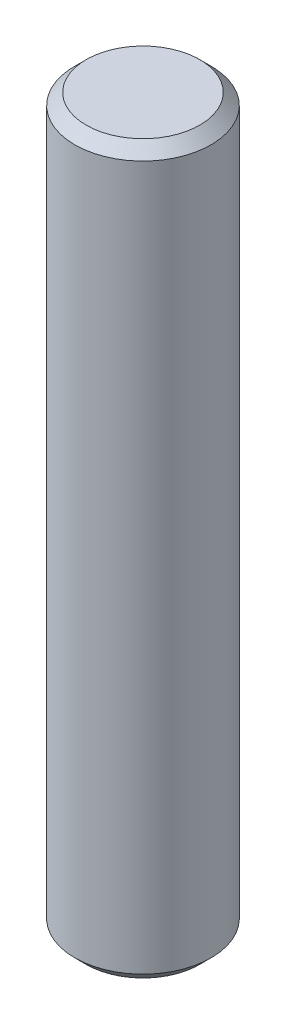
ISO-10303-21;
HEADER;
FILE_DESCRIPTION(('STEP AP214'),'2;1');
FILE_NAME('part.step','',(''),(''),'','','');
FILE_SCHEMA(('AUTOMOTIVE_DESIGN { 1 0 10303 214 1 1 1 1 }'));
ENDSEC;
DATA;
#1=APPLICATION_CONTEXT('core data for automotive mechanical design processes');
#2=APPLICATION_PROTOCOL_DEFINITION('international standard','automotive_design',2000,#1);
#3=PRODUCT_CONTEXT('',#1,'mechanical');
#4=PRODUCT('Part','Part','',(#3));
#5=PRODUCT_RELATED_PRODUCT_CATEGORY('part','',(#4));
#6=PRODUCT_DEFINITION_FORMATION('','',#4);
#7=PRODUCT_DEFINITION_CONTEXT('part definition',#1,'design');
#8=PRODUCT_DEFINITION('design','',#6,#7);
#9=PRODUCT_DEFINITION_SHAPE('','',#8);
#10=(LENGTH_UNIT() NAMED_UNIT(*) SI_UNIT(.MILLI.,.METRE.));
#11=(NAMED_UNIT(*) PLANE_ANGLE_UNIT() SI_UNIT($,.RADIAN.));
#12=(NAMED_UNIT(*) SI_UNIT($,.STERADIAN.) SOLID_ANGLE_UNIT());
#13=UNCERTAINTY_MEASURE_WITH_UNIT(LENGTH_MEASURE(1.E-05),#10,'distance_accuracy_value','');
#14=(GEOMETRIC_REPRESENTATION_CONTEXT(3) GLOBAL_UNCERTAINTY_ASSIGNED_CONTEXT((#13)) GLOBAL_UNIT_ASSIGNED_CONTEXT((#10,
#11,#12)) REPRESENTATION_CONTEXT('',''));
#15=CARTESIAN_POINT('',(0.,0.,0.));
#16=DIRECTION('',(0.,0.,1.));
#17=DIRECTION('',(1.,0.,0.));
#18=AXIS2_PLACEMENT_3D('',#15,#16,#17);
#19=CARTESIAN_POINT('',(0.,-32.,0.));
#20=DIRECTION('',(0.,1.,0.));
#21=DIRECTION('',(0.,0.,1.));
#22=AXIS2_PLACEMENT_3D('',#19,#20,#21);
#23=CYLINDRICAL_SURFACE('',#22,3.);
#24=CARTESIAN_POINT('',(0.,-31.5,0.));
#25=DIRECTION('',(0.,1.,0.));
#26=DIRECTION('',(0.,0.,1.));
#27=AXIS2_PLACEMENT_3D('',#24,#25,#26);
#28=CIRCLE('',#27,3.);
#29=CARTESIAN_POINT('',(0.,-31.5,3.));
#30=VERTEX_POINT('',#29);
#31=EDGE_CURVE('E59',#30,#30,#28,.T.);
#32=ORIENTED_EDGE('',*,*,#31,.T.);
#33=EDGE_LOOP('',(#32));
#34=FACE_BOUND('',#33,.T.);
#35=CARTESIAN_POINT('',(0.,-0.499999999999994,0.));
#36=DIRECTION('',(0.,1.,0.));
#37=DIRECTION('',(0.,0.,1.));
#38=AXIS2_PLACEMENT_3D('',#35,#36,#37);
#39=CIRCLE('',#38,3.);
#40=CARTESIAN_POINT('',(0.,-0.499999999999994,3.));
#41=VERTEX_POINT('',#40);
#42=EDGE_CURVE('E63',#41,#41,#39,.F.);
#43=ORIENTED_EDGE('',*,*,#42,.T.);
#44=EDGE_LOOP('',(#43));
#45=FACE_BOUND('',#44,.T.);
#46=ADVANCED_FACE('F47',(#34,#45),#23,.T.);
#47=CARTESIAN_POINT('',(0.,-32.,0.));
#48=DIRECTION('',(0.,1.,0.));
#49=DIRECTION('',(0.,0.,1.));
#50=AXIS2_PLACEMENT_3D('',#47,#48,#49);
#51=PLANE('',#50);
#52=CARTESIAN_POINT('',(0.,-32.,0.));
#53=DIRECTION('',(0.,1.,0.));
#54=DIRECTION('',(0.,0.,1.));
#55=AXIS2_PLACEMENT_3D('',#52,#53,#54);
#56=CIRCLE('',#55,2.5);
#57=CARTESIAN_POINT('',(0.,-32.,2.5));
#58=VERTEX_POINT('',#57);
#59=EDGE_CURVE('E55',#58,#58,#56,.F.);
#60=ORIENTED_EDGE('',*,*,#59,.T.);
#61=EDGE_LOOP('',(#60));
#62=FACE_BOUND('',#61,.T.);
#63=ADVANCED_FACE('F80',(#62),#51,.F.);
#64=CARTESIAN_POINT('',(0.,0.,0.));
#65=DIRECTION('',(0.,1.,0.));
#66=DIRECTION('',(0.,0.,1.));
#67=AXIS2_PLACEMENT_3D('',#64,#65,#66);
#68=PLANE('',#67);
#69=CARTESIAN_POINT('',(0.,0.,0.));
#70=DIRECTION('',(0.,1.,0.));
#71=DIRECTION('',(0.,0.,1.));
#72=AXIS2_PLACEMENT_3D('',#69,#70,#71);
#73=CIRCLE('',#72,2.50000000000001);
#74=CARTESIAN_POINT('',(0.,0.,2.50000000000001));
#75=VERTEX_POINT('',#74);
#76=EDGE_CURVE('E10',#75,#75,#73,.T.);
#77=ORIENTED_EDGE('',*,*,#76,.T.);
#78=EDGE_LOOP('',(#77));
#79=FACE_BOUND('',#78,.T.);
#80=ADVANCED_FACE('F77',(#79),#68,.T.);
#81=CARTESIAN_POINT('',(0.,-31.5,0.));
#82=DIRECTION('',(0.,1.,0.));
#83=DIRECTION('',(0.,0.,1.));
#84=AXIS2_PLACEMENT_3D('',#81,#82,#83);
#85=CONICAL_SURFACE('',#84,3.,0.785398163397446);
#86=ORIENTED_EDGE('',*,*,#59,.F.);
#87=EDGE_LOOP('',(#86));
#88=FACE_BOUND('',#87,.T.);
#89=ORIENTED_EDGE('',*,*,#31,.F.);
#90=EDGE_LOOP('',(#89));
#91=FACE_BOUND('',#90,.T.);
#92=ADVANCED_FACE('F72',(#88,#91),#85,.T.);
#93=CARTESIAN_POINT('',(0.,0.,0.));
#94=DIRECTION('',(0.,-1.,0.));
#95=DIRECTION('',(0.,0.,-1.));
#96=AXIS2_PLACEMENT_3D('',#93,#94,#95);
#97=CONICAL_SURFACE('',#96,2.50000000000001,0.78539816339745);
#98=ORIENTED_EDGE('',*,*,#42,.F.);
#99=EDGE_LOOP('',(#98));
#100=FACE_BOUND('',#99,.T.);
#101=ORIENTED_EDGE('',*,*,#76,.F.);
#102=EDGE_LOOP('',(#101));
#103=FACE_BOUND('',#102,.T.);
#104=ADVANCED_FACE('F50',(#100,#103),#97,.T.);
#105=CLOSED_SHELL('',(#46,#63,#80,#92,#104));
#106=MANIFOLD_SOLID_BREP('B2',#105);
#107=ADVANCED_BREP_SHAPE_REPRESENTATION('',(#18,#106),#14);
#108=SHAPE_DEFINITION_REPRESENTATION(#9,#107);
ENDSEC;
END-ISO-10303-21;
